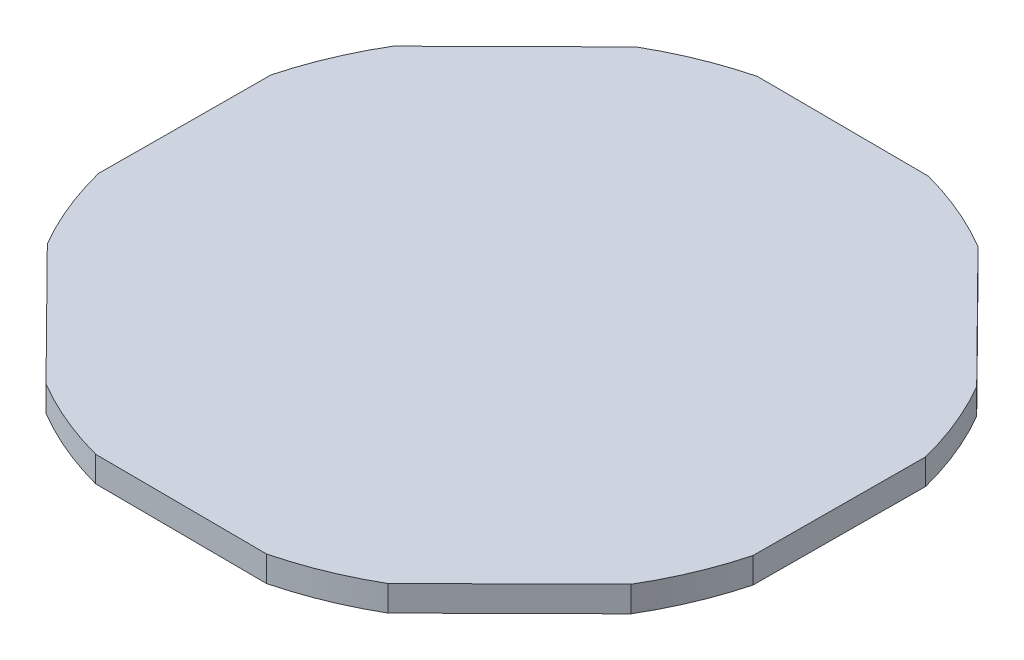
ISO-10303-21;
HEADER;
FILE_DESCRIPTION(('STEP AP214'),'2;1');
FILE_NAME('part.step','',(''),(''),'','','');
FILE_SCHEMA(('AUTOMOTIVE_DESIGN { 1 0 10303 214 1 1 1 1 }'));
ENDSEC;
DATA;
#1=APPLICATION_CONTEXT('core data for automotive mechanical design processes');
#2=APPLICATION_PROTOCOL_DEFINITION('international standard','automotive_design',2000,#1);
#3=PRODUCT_CONTEXT('',#1,'mechanical');
#4=PRODUCT('Part','Part','',(#3));
#5=PRODUCT_RELATED_PRODUCT_CATEGORY('part','',(#4));
#6=PRODUCT_DEFINITION_FORMATION('','',#4);
#7=PRODUCT_DEFINITION_CONTEXT('part definition',#1,'design');
#8=PRODUCT_DEFINITION('design','',#6,#7);
#9=PRODUCT_DEFINITION_SHAPE('','',#8);
#10=(LENGTH_UNIT() NAMED_UNIT(*) SI_UNIT(.MILLI.,.METRE.));
#11=(NAMED_UNIT(*) PLANE_ANGLE_UNIT() SI_UNIT($,.RADIAN.));
#12=(NAMED_UNIT(*) SI_UNIT($,.STERADIAN.) SOLID_ANGLE_UNIT());
#13=UNCERTAINTY_MEASURE_WITH_UNIT(LENGTH_MEASURE(1.E-05),#10,'distance_accuracy_value','');
#14=(GEOMETRIC_REPRESENTATION_CONTEXT(3) GLOBAL_UNCERTAINTY_ASSIGNED_CONTEXT((#13)) GLOBAL_UNIT_ASSIGNED_CONTEXT((#10,
#11,#12)) REPRESENTATION_CONTEXT('',''));
#15=CARTESIAN_POINT('',(0.,0.,0.));
#16=DIRECTION('',(0.,0.,1.));
#17=DIRECTION('',(1.,0.,0.));
#18=AXIS2_PLACEMENT_3D('',#15,#16,#17);
#19=CARTESIAN_POINT('',(0.,-43.64,0.));
#20=DIRECTION('',(0.,1.,0.));
#21=DIRECTION('',(0.,0.,1.));
#22=AXIS2_PLACEMENT_3D('',#19,#20,#21);
#23=PLANE('',#22);
#24=CARTESIAN_POINT('',(0.,-43.64,0.));
#25=DIRECTION('',(0.,1.,0.));
#26=DIRECTION('',(0.,0.,1.));
#27=AXIS2_PLACEMENT_3D('',#24,#25,#26);
#28=CIRCLE('',#27,126.4);
#29=CARTESIAN_POINT('',(-109.404253319129,-43.64,63.3061557487417));
#30=VERTEX_POINT('',#29);
#31=CARTESIAN_POINT('',(-122.471688325826,-43.64,31.2673241359349));
#32=VERTEX_POINT('',#31);
#33=EDGE_CURVE('E237',#30,#32,#28,.F.);
#34=ORIENTED_EDGE('',*,*,#33,.F.);
#35=DIRECTION('',(0.703254513464331,0.,0.710938175435844));
#36=VECTOR('',#35,1.);
#37=CARTESIAN_POINT('',(-51.3220476008247,-43.64,122.022959648436));
#38=LINE('',#37,#36);
#39=CARTESIAN_POINT('',(-64.4912243924798,-43.64,108.709898244635));
#40=VERTEX_POINT('',#39);
#41=EDGE_CURVE('E140',#30,#40,#38,.T.);
#42=ORIENTED_EDGE('',*,*,#41,.T.);
#43=CARTESIAN_POINT('',(0.,-43.64,0.));
#44=DIRECTION('',(0.,1.,0.));
#45=DIRECTION('',(0.,0.,1.));
#46=AXIS2_PLACEMENT_3D('',#43,#44,#45);
#47=CIRCLE('',#46,126.4);
#48=CARTESIAN_POINT('',(-32.5962773918198,-43.64,122.124701433394));
#49=VERTEX_POINT('',#48);
#50=EDGE_CURVE('E240',#49,#40,#47,.F.);
#51=ORIENTED_EDGE('',*,*,#50,.F.);
#52=DIRECTION('',(0.999985240225751,0.,0.00543316948440253));
#53=VECTOR('',#52,1.);
#54=CARTESIAN_POINT('',(49.9930943449399,-43.64,122.573430110784));
#55=LINE('',#54,#53);
#56=CARTESIAN_POINT('',(31.2673241359349,-43.64,122.471688325826));
#57=VERTEX_POINT('',#56);
#58=EDGE_CURVE('E344',#49,#57,#55,.T.);
#59=ORIENTED_EDGE('',*,*,#58,.T.);
#60=CARTESIAN_POINT('',(0.,-43.64,0.));
#61=DIRECTION('',(0.,1.,0.));
#62=DIRECTION('',(0.,0.,1.));
#63=AXIS2_PLACEMENT_3D('',#60,#61,#62);
#64=CIRCLE('',#63,126.4);
#65=CARTESIAN_POINT('',(63.3061557487418,-43.64,109.404253319129));
#66=VERTEX_POINT('',#65);
#67=EDGE_CURVE('E244',#66,#57,#64,.F.);
#68=ORIENTED_EDGE('',*,*,#67,.F.);
#69=DIRECTION('',(0.710938175435844,0.,-0.703254513464331));
#70=VECTOR('',#69,1.);
#71=CARTESIAN_POINT('',(122.022959648436,-43.64,51.3220476008247));
#72=LINE('',#71,#70);
#73=CARTESIAN_POINT('',(108.709898244634,-43.64,64.4912243924799));
#74=VERTEX_POINT('',#73);
#75=EDGE_CURVE('E348',#66,#74,#72,.T.);
#76=ORIENTED_EDGE('',*,*,#75,.T.);
#77=CARTESIAN_POINT('',(0.,-43.64,0.));
#78=DIRECTION('',(0.,1.,0.));
#79=DIRECTION('',(0.,0.,1.));
#80=AXIS2_PLACEMENT_3D('',#77,#78,#79);
#81=CIRCLE('',#80,126.4);
#82=CARTESIAN_POINT('',(122.124701433394,-43.64,32.5962773918199));
#83=VERTEX_POINT('',#82);
#84=EDGE_CURVE('E248',#83,#74,#81,.F.);
#85=ORIENTED_EDGE('',*,*,#84,.F.);
#86=DIRECTION('',(0.00543316948440239,0.,-0.999985240225751));
#87=VECTOR('',#86,1.);
#88=CARTESIAN_POINT('',(122.573430110784,-43.64,-49.9930943449399));
#89=LINE('',#88,#87);
#90=CARTESIAN_POINT('',(122.471688325826,-43.64,-31.2673241359352));
#91=VERTEX_POINT('',#90);
#92=EDGE_CURVE('E272',#83,#91,#89,.T.);
#93=ORIENTED_EDGE('',*,*,#92,.T.);
#94=CARTESIAN_POINT('',(0.,-43.64,0.));
#95=DIRECTION('',(0.,1.,0.));
#96=DIRECTION('',(0.,0.,1.));
#97=AXIS2_PLACEMENT_3D('',#94,#95,#96);
#98=CIRCLE('',#97,126.4);
#99=CARTESIAN_POINT('',(109.404253319129,-43.64,-63.3061557487416));
#100=VERTEX_POINT('',#99);
#101=EDGE_CURVE('E252',#100,#91,#98,.F.);
#102=ORIENTED_EDGE('',*,*,#101,.F.);
#103=DIRECTION('',(-0.703254513464331,0.,-0.710938175435844));
#104=VECTOR('',#103,1.);
#105=CARTESIAN_POINT('',(51.3220476008247,-43.64,-122.022959648436));
#106=LINE('',#105,#104);
#107=CARTESIAN_POINT('',(64.4912243924798,-43.64,-108.709898244635));
#108=VERTEX_POINT('',#107);
#109=EDGE_CURVE('E227',#100,#108,#106,.T.);
#110=ORIENTED_EDGE('',*,*,#109,.T.);
#111=CARTESIAN_POINT('',(0.,-43.64,0.));
#112=DIRECTION('',(0.,1.,0.));
#113=DIRECTION('',(0.,0.,1.));
#114=AXIS2_PLACEMENT_3D('',#111,#112,#113);
#115=CIRCLE('',#114,126.4);
#116=CARTESIAN_POINT('',(32.5962773918198,-43.64,-122.124701433394));
#117=VERTEX_POINT('',#116);
#118=EDGE_CURVE('E187',#117,#108,#115,.F.);
#119=ORIENTED_EDGE('',*,*,#118,.F.);
#120=DIRECTION('',(-0.999985240225751,0.,-0.00543316948440308));
#121=VECTOR('',#120,1.);
#122=CARTESIAN_POINT('',(-49.9930943449398,-43.64,-122.573430110784));
#123=LINE('',#122,#121);
#124=CARTESIAN_POINT('',(-31.2673241359349,-43.64,-122.471688325826));
#125=VERTEX_POINT('',#124);
#126=EDGE_CURVE('E256',#117,#125,#123,.T.);
#127=ORIENTED_EDGE('',*,*,#126,.T.);
#128=CARTESIAN_POINT('',(0.,-43.64,0.));
#129=DIRECTION('',(0.,1.,0.));
#130=DIRECTION('',(0.,0.,1.));
#131=AXIS2_PLACEMENT_3D('',#128,#129,#130);
#132=CIRCLE('',#131,126.4);
#133=CARTESIAN_POINT('',(-63.3061557487416,-43.64,-109.404253319129));
#134=VERTEX_POINT('',#133);
#135=EDGE_CURVE('E228',#134,#125,#132,.F.);
#136=ORIENTED_EDGE('',*,*,#135,.F.);
#137=DIRECTION('',(-0.710938175435844,0.,0.703254513464331));
#138=VECTOR('',#137,1.);
#139=CARTESIAN_POINT('',(-122.022959648436,-43.64,-51.3220476008247));
#140=LINE('',#139,#138);
#141=CARTESIAN_POINT('',(-108.709898244635,-43.64,-64.4912243924799));
#142=VERTEX_POINT('',#141);
#143=EDGE_CURVE('E261',#134,#142,#140,.T.);
#144=ORIENTED_EDGE('',*,*,#143,.T.);
#145=CARTESIAN_POINT('',(0.,-43.64,0.));
#146=DIRECTION('',(0.,1.,0.));
#147=DIRECTION('',(0.,0.,1.));
#148=AXIS2_PLACEMENT_3D('',#145,#146,#147);
#149=CIRCLE('',#148,126.4);
#150=CARTESIAN_POINT('',(-122.124701433394,-43.64,-32.5962773918197));
#151=VERTEX_POINT('',#150);
#152=EDGE_CURVE('E233',#151,#142,#149,.F.);
#153=ORIENTED_EDGE('',*,*,#152,.F.);
#154=DIRECTION('',(-0.00543316948440226,0.,0.999985240225751));
#155=VECTOR('',#154,1.);
#156=CARTESIAN_POINT('',(-122.573430110784,-43.64,49.9930943449399));
#157=LINE('',#156,#155);
#158=EDGE_CURVE('E343',#151,#32,#157,.T.);
#159=ORIENTED_EDGE('',*,*,#158,.T.);
#160=EDGE_LOOP('',(#34,#42,#51,#59,#68,#76,#85,#93,#102,#110,#119,#127,#136,#144,#153,#159));
#161=FACE_BOUND('',#160,.T.);
#162=ADVANCED_FACE('F19',(#161),#23,.T.);
#163=CARTESIAN_POINT('',(0.,-53.14,0.));
#164=DIRECTION('',(0.,1.,0.));
#165=DIRECTION('',(0.,0.,1.));
#166=AXIS2_PLACEMENT_3D('',#163,#164,#165);
#167=CYLINDRICAL_SURFACE('',#166,126.4);
#168=DIRECTION('',(0.,1.,0.));
#169=VECTOR('',#168,1.);
#170=CARTESIAN_POINT('',(109.404253319129,-53.14,-63.3061557487416));
#171=LINE('',#170,#169);
#172=CARTESIAN_POINT('',(109.404253319129,-53.165,-63.3061557487416));
#173=VERTEX_POINT('',#172);
#174=EDGE_CURVE('E11',#173,#100,#171,.T.);
#175=ORIENTED_EDGE('',*,*,#174,.T.);
#176=ORIENTED_EDGE('',*,*,#101,.T.);
#177=DIRECTION('',(0.,-1.,0.));
#178=VECTOR('',#177,1.);
#179=CARTESIAN_POINT('',(122.471688325826,-53.14,-31.2673241359352));
#180=LINE('',#179,#178);
#181=CARTESIAN_POINT('',(122.471688325826,-53.165,-31.2673241359352));
#182=VERTEX_POINT('',#181);
#183=EDGE_CURVE('E182',#91,#182,#180,.T.);
#184=ORIENTED_EDGE('',*,*,#183,.T.);
#185=CARTESIAN_POINT('',(0.,-53.165,0.));
#186=DIRECTION('',(0.,1.,0.));
#187=DIRECTION('',(0.,0.,1.));
#188=AXIS2_PLACEMENT_3D('',#185,#186,#187);
#189=CIRCLE('',#188,126.4);
#190=EDGE_CURVE('E203',#182,#173,#189,.T.);
#191=ORIENTED_EDGE('',*,*,#190,.T.);
#192=EDGE_LOOP('',(#175,#176,#184,#191));
#193=FACE_BOUND('',#192,.T.);
#194=ADVANCED_FACE('F309',(#193),#167,.T.);
#195=CARTESIAN_POINT('',(0.,-53.14,0.));
#196=DIRECTION('',(0.,1.,0.));
#197=DIRECTION('',(0.,0.,1.));
#198=AXIS2_PLACEMENT_3D('',#195,#196,#197);
#199=CYLINDRICAL_SURFACE('',#198,126.4);
#200=DIRECTION('',(0.,1.,0.));
#201=VECTOR('',#200,1.);
#202=CARTESIAN_POINT('',(122.124701433394,-53.14,32.5962773918199));
#203=LINE('',#202,#201);
#204=CARTESIAN_POINT('',(122.124701433393,-53.165,32.5962773918199));
#205=VERTEX_POINT('',#204);
#206=EDGE_CURVE('E178',#205,#83,#203,.T.);
#207=ORIENTED_EDGE('',*,*,#206,.T.);
#208=ORIENTED_EDGE('',*,*,#84,.T.);
#209=DIRECTION('',(0.,-1.,0.));
#210=VECTOR('',#209,1.);
#211=CARTESIAN_POINT('',(108.709898244634,-53.14,64.4912243924799));
#212=LINE('',#211,#210);
#213=CARTESIAN_POINT('',(108.709898244634,-53.165,64.4912243924799));
#214=VERTEX_POINT('',#213);
#215=EDGE_CURVE('E298',#74,#214,#212,.T.);
#216=ORIENTED_EDGE('',*,*,#215,.T.);
#217=CARTESIAN_POINT('',(0.,-53.165,0.));
#218=DIRECTION('',(0.,1.,0.));
#219=DIRECTION('',(0.,0.,1.));
#220=AXIS2_PLACEMENT_3D('',#217,#218,#219);
#221=CIRCLE('',#220,126.4);
#222=EDGE_CURVE('E320',#214,#205,#221,.T.);
#223=ORIENTED_EDGE('',*,*,#222,.T.);
#224=EDGE_LOOP('',(#207,#208,#216,#223));
#225=FACE_BOUND('',#224,.T.);
#226=ADVANCED_FACE('F362',(#225),#199,.T.);
#227=CARTESIAN_POINT('',(0.,-53.14,0.));
#228=DIRECTION('',(0.,1.,0.));
#229=DIRECTION('',(0.,0.,1.));
#230=AXIS2_PLACEMENT_3D('',#227,#228,#229);
#231=CYLINDRICAL_SURFACE('',#230,126.4);
#232=DIRECTION('',(0.,1.,0.));
#233=VECTOR('',#232,1.);
#234=CARTESIAN_POINT('',(63.3061557487418,-53.14,109.404253319129));
#235=LINE('',#234,#233);
#236=CARTESIAN_POINT('',(63.3061557487418,-53.165,109.404253319129));
#237=VERTEX_POINT('',#236);
#238=EDGE_CURVE('E300',#237,#66,#235,.T.);
#239=ORIENTED_EDGE('',*,*,#238,.T.);
#240=ORIENTED_EDGE('',*,*,#67,.T.);
#241=DIRECTION('',(0.,-1.,0.));
#242=VECTOR('',#241,1.);
#243=CARTESIAN_POINT('',(31.2673241359349,-53.14,122.471688325826));
#244=LINE('',#243,#242);
#245=CARTESIAN_POINT('',(31.2673241359349,-53.165,122.471688325826));
#246=VERTEX_POINT('',#245);
#247=EDGE_CURVE('E146',#57,#246,#244,.T.);
#248=ORIENTED_EDGE('',*,*,#247,.T.);
#249=CARTESIAN_POINT('',(0.,-53.165,0.));
#250=DIRECTION('',(0.,1.,0.));
#251=DIRECTION('',(0.,0.,1.));
#252=AXIS2_PLACEMENT_3D('',#249,#250,#251);
#253=CIRCLE('',#252,126.4);
#254=EDGE_CURVE('E328',#246,#237,#253,.T.);
#255=ORIENTED_EDGE('',*,*,#254,.T.);
#256=EDGE_LOOP('',(#239,#240,#248,#255));
#257=FACE_BOUND('',#256,.T.);
#258=ADVANCED_FACE('F384',(#257),#231,.T.);
#259=CARTESIAN_POINT('',(0.,-53.14,0.));
#260=DIRECTION('',(0.,1.,0.));
#261=DIRECTION('',(0.,0.,1.));
#262=AXIS2_PLACEMENT_3D('',#259,#260,#261);
#263=CYLINDRICAL_SURFACE('',#262,126.4);
#264=DIRECTION('',(0.,1.,0.));
#265=VECTOR('',#264,1.);
#266=CARTESIAN_POINT('',(-32.5962773918198,-53.14,122.124701433394));
#267=LINE('',#266,#265);
#268=CARTESIAN_POINT('',(-32.5962773918198,-53.165,122.124701433394));
#269=VERTEX_POINT('',#268);
#270=EDGE_CURVE('E294',#269,#49,#267,.T.);
#271=ORIENTED_EDGE('',*,*,#270,.T.);
#272=ORIENTED_EDGE('',*,*,#50,.T.);
#273=DIRECTION('',(0.,-1.,0.));
#274=VECTOR('',#273,1.);
#275=CARTESIAN_POINT('',(-64.4912243924798,-53.14,108.709898244635));
#276=LINE('',#275,#274);
#277=CARTESIAN_POINT('',(-64.4912243924798,-53.165,108.709898244635));
#278=VERTEX_POINT('',#277);
#279=EDGE_CURVE('E147',#40,#278,#276,.T.);
#280=ORIENTED_EDGE('',*,*,#279,.T.);
#281=CARTESIAN_POINT('',(0.,-53.165,0.));
#282=DIRECTION('',(0.,1.,0.));
#283=DIRECTION('',(0.,0.,1.));
#284=AXIS2_PLACEMENT_3D('',#281,#282,#283);
#285=CIRCLE('',#284,126.4);
#286=EDGE_CURVE('E158',#278,#269,#285,.T.);
#287=ORIENTED_EDGE('',*,*,#286,.T.);
#288=EDGE_LOOP('',(#271,#272,#280,#287));
#289=FACE_BOUND('',#288,.T.);
#290=ADVANCED_FACE('F336',(#289),#263,.T.);
#291=CARTESIAN_POINT('',(0.,-53.14,0.));
#292=DIRECTION('',(0.,1.,0.));
#293=DIRECTION('',(0.,0.,1.));
#294=AXIS2_PLACEMENT_3D('',#291,#292,#293);
#295=CYLINDRICAL_SURFACE('',#294,126.4);
#296=DIRECTION('',(0.,1.,0.));
#297=VECTOR('',#296,1.);
#298=CARTESIAN_POINT('',(-109.404253319129,-53.14,63.3061557487417));
#299=LINE('',#298,#297);
#300=CARTESIAN_POINT('',(-109.404253319129,-53.165,63.3061557487416));
#301=VERTEX_POINT('',#300);
#302=EDGE_CURVE('E135',#301,#30,#299,.T.);
#303=ORIENTED_EDGE('',*,*,#302,.T.);
#304=ORIENTED_EDGE('',*,*,#33,.T.);
#305=DIRECTION('',(0.,-1.,0.));
#306=VECTOR('',#305,1.);
#307=CARTESIAN_POINT('',(-122.471688325826,-53.14,31.2673241359349));
#308=LINE('',#307,#306);
#309=CARTESIAN_POINT('',(-122.471688325826,-53.165,31.2673241359349));
#310=VERTEX_POINT('',#309);
#311=EDGE_CURVE('E162',#32,#310,#308,.T.);
#312=ORIENTED_EDGE('',*,*,#311,.T.);
#313=CARTESIAN_POINT('',(0.,-53.165,0.));
#314=DIRECTION('',(0.,1.,0.));
#315=DIRECTION('',(0.,0.,1.));
#316=AXIS2_PLACEMENT_3D('',#313,#314,#315);
#317=CIRCLE('',#316,126.4);
#318=EDGE_CURVE('E154',#310,#301,#317,.T.);
#319=ORIENTED_EDGE('',*,*,#318,.T.);
#320=EDGE_LOOP('',(#303,#304,#312,#319));
#321=FACE_BOUND('',#320,.T.);
#322=ADVANCED_FACE('F161',(#321),#295,.T.);
#323=CARTESIAN_POINT('',(0.,-53.14,0.));
#324=DIRECTION('',(0.,1.,0.));
#325=DIRECTION('',(0.,0.,1.));
#326=AXIS2_PLACEMENT_3D('',#323,#324,#325);
#327=CYLINDRICAL_SURFACE('',#326,126.4);
#328=DIRECTION('',(0.,1.,0.));
#329=VECTOR('',#328,1.);
#330=CARTESIAN_POINT('',(-122.124701433394,-53.14,-32.5962773918197));
#331=LINE('',#330,#329);
#332=CARTESIAN_POINT('',(-122.124701433394,-53.165,-32.5962773918197));
#333=VERTEX_POINT('',#332);
#334=EDGE_CURVE('E284',#333,#151,#331,.T.);
#335=ORIENTED_EDGE('',*,*,#334,.T.);
#336=ORIENTED_EDGE('',*,*,#152,.T.);
#337=DIRECTION('',(0.,-1.,0.));
#338=VECTOR('',#337,1.);
#339=CARTESIAN_POINT('',(-108.709898244635,-53.14,-64.4912243924799));
#340=LINE('',#339,#338);
#341=CARTESIAN_POINT('',(-108.709898244635,-53.165,-64.4912243924799));
#342=VERTEX_POINT('',#341);
#343=EDGE_CURVE('E280',#142,#342,#340,.T.);
#344=ORIENTED_EDGE('',*,*,#343,.T.);
#345=CARTESIAN_POINT('',(0.,-53.165,0.));
#346=DIRECTION('',(0.,1.,0.));
#347=DIRECTION('',(0.,0.,1.));
#348=AXIS2_PLACEMENT_3D('',#345,#346,#347);
#349=CIRCLE('',#348,126.4);
#350=EDGE_CURVE('E220',#342,#333,#349,.T.);
#351=ORIENTED_EDGE('',*,*,#350,.T.);
#352=EDGE_LOOP('',(#335,#336,#344,#351));
#353=FACE_BOUND('',#352,.T.);
#354=ADVANCED_FACE('F396',(#353),#327,.T.);
#355=CARTESIAN_POINT('',(0.,-53.14,0.));
#356=DIRECTION('',(0.,1.,0.));
#357=DIRECTION('',(0.,0.,1.));
#358=AXIS2_PLACEMENT_3D('',#355,#356,#357);
#359=CYLINDRICAL_SURFACE('',#358,126.4);
#360=DIRECTION('',(0.,1.,0.));
#361=VECTOR('',#360,1.);
#362=CARTESIAN_POINT('',(32.5962773918198,-53.14,-122.124701433394));
#363=LINE('',#362,#361);
#364=CARTESIAN_POINT('',(32.5962773918198,-53.165,-122.124701433394));
#365=VERTEX_POINT('',#364);
#366=EDGE_CURVE('E44',#365,#117,#363,.T.);
#367=ORIENTED_EDGE('',*,*,#366,.T.);
#368=ORIENTED_EDGE('',*,*,#118,.T.);
#369=DIRECTION('',(0.,-1.,0.));
#370=VECTOR('',#369,1.);
#371=CARTESIAN_POINT('',(64.4912243924798,-53.14,-108.709898244635));
#372=LINE('',#371,#370);
#373=CARTESIAN_POINT('',(64.4912243924798,-53.165,-108.709898244635));
#374=VERTEX_POINT('',#373);
#375=EDGE_CURVE('E29',#108,#374,#372,.T.);
#376=ORIENTED_EDGE('',*,*,#375,.T.);
#377=CARTESIAN_POINT('',(0.,-53.165,0.));
#378=DIRECTION('',(0.,1.,0.));
#379=DIRECTION('',(0.,0.,1.));
#380=AXIS2_PLACEMENT_3D('',#377,#378,#379);
#381=CIRCLE('',#380,126.4);
#382=EDGE_CURVE('E186',#374,#365,#381,.T.);
#383=ORIENTED_EDGE('',*,*,#382,.T.);
#384=EDGE_LOOP('',(#367,#368,#376,#383));
#385=FACE_BOUND('',#384,.T.);
#386=ADVANCED_FACE('F185',(#385),#359,.T.);
#387=CARTESIAN_POINT('',(0.,-53.14,0.));
#388=DIRECTION('',(0.,1.,0.));
#389=DIRECTION('',(0.,0.,1.));
#390=AXIS2_PLACEMENT_3D('',#387,#388,#389);
#391=CYLINDRICAL_SURFACE('',#390,126.4);
#392=DIRECTION('',(0.,1.,0.));
#393=VECTOR('',#392,1.);
#394=CARTESIAN_POINT('',(-63.3061557487416,-53.14,-109.404253319129));
#395=LINE('',#394,#393);
#396=CARTESIAN_POINT('',(-63.3061557487416,-53.165,-109.404253319129));
#397=VERTEX_POINT('',#396);
#398=EDGE_CURVE('E418',#397,#134,#395,.T.);
#399=ORIENTED_EDGE('',*,*,#398,.T.);
#400=ORIENTED_EDGE('',*,*,#135,.T.);
#401=DIRECTION('',(0.,-1.,0.));
#402=VECTOR('',#401,1.);
#403=CARTESIAN_POINT('',(-31.2673241359349,-53.14,-122.471688325826));
#404=LINE('',#403,#402);
#405=CARTESIAN_POINT('',(-31.2673241359348,-53.165,-122.471688325826));
#406=VERTEX_POINT('',#405);
#407=EDGE_CURVE('E36',#125,#406,#404,.T.);
#408=ORIENTED_EDGE('',*,*,#407,.T.);
#409=CARTESIAN_POINT('',(0.,-53.165,0.));
#410=DIRECTION('',(0.,1.,0.));
#411=DIRECTION('',(0.,0.,1.));
#412=AXIS2_PLACEMENT_3D('',#409,#410,#411);
#413=CIRCLE('',#412,126.4);
#414=EDGE_CURVE('E212',#406,#397,#413,.T.);
#415=ORIENTED_EDGE('',*,*,#414,.T.);
#416=EDGE_LOOP('',(#399,#400,#408,#415));
#417=FACE_BOUND('',#416,.T.);
#418=ADVANCED_FACE('F409',(#417),#391,.T.);
#419=CARTESIAN_POINT('',(-49.9930943449398,-43.64,-122.573430110784));
#420=DIRECTION('',(-0.00543316948440308,0.,0.999985240225751));
#421=DIRECTION('',(0.,1.,0.));
#422=AXIS2_PLACEMENT_3D('',#419,#420,#421);
#423=PLANE('',#422);
#424=ORIENTED_EDGE('',*,*,#126,.F.);
#425=ORIENTED_EDGE('',*,*,#366,.F.);
#426=DIRECTION('',(-0.999985240225751,0.,-0.00543316948440216));
#427=VECTOR('',#426,1.);
#428=CARTESIAN_POINT('',(32.5962773918198,-53.165,-122.124701433394));
#429=LINE('',#428,#427);
#430=EDGE_CURVE('E198',#365,#406,#429,.T.);
#431=ORIENTED_EDGE('',*,*,#430,.T.);
#432=ORIENTED_EDGE('',*,*,#407,.F.);
#433=EDGE_LOOP('',(#424,#425,#431,#432));
#434=FACE_BOUND('',#433,.T.);
#435=ADVANCED_FACE('F21',(#434),#423,.F.);
#436=CARTESIAN_POINT('',(-122.022959648436,-43.64,-51.3220476008247));
#437=DIRECTION('',(0.703254513464331,0.,0.710938175435844));
#438=DIRECTION('',(0.,-1.,0.));
#439=AXIS2_PLACEMENT_3D('',#436,#437,#438);
#440=PLANE('',#439);
#441=ORIENTED_EDGE('',*,*,#143,.F.);
#442=ORIENTED_EDGE('',*,*,#398,.F.);
#443=DIRECTION('',(-0.710938175435846,0.,0.70325451346433));
#444=VECTOR('',#443,1.);
#445=CARTESIAN_POINT('',(-63.3061557487416,-53.165,-109.404253319129));
#446=LINE('',#445,#444);
#447=EDGE_CURVE('E216',#397,#342,#446,.T.);
#448=ORIENTED_EDGE('',*,*,#447,.T.);
#449=ORIENTED_EDGE('',*,*,#343,.F.);
#450=EDGE_LOOP('',(#441,#442,#448,#449));
#451=FACE_BOUND('',#450,.T.);
#452=ADVANCED_FACE('F407',(#451),#440,.F.);
#453=CARTESIAN_POINT('',(-122.573430110784,-43.64,49.9930943449399));
#454=DIRECTION('',(0.999985240225751,0.,0.00543316948440226));
#455=DIRECTION('',(0.,-1.,0.));
#456=AXIS2_PLACEMENT_3D('',#453,#454,#455);
#457=PLANE('',#456);
#458=ORIENTED_EDGE('',*,*,#158,.F.);
#459=ORIENTED_EDGE('',*,*,#334,.F.);
#460=DIRECTION('',(-0.00543316948440238,0.,0.999985240225751));
#461=VECTOR('',#460,1.);
#462=CARTESIAN_POINT('',(-122.124701433394,-53.165,-32.5962773918197));
#463=LINE('',#462,#461);
#464=EDGE_CURVE('E224',#333,#310,#463,.T.);
#465=ORIENTED_EDGE('',*,*,#464,.T.);
#466=ORIENTED_EDGE('',*,*,#311,.F.);
#467=EDGE_LOOP('',(#458,#459,#465,#466));
#468=FACE_BOUND('',#467,.T.);
#469=ADVANCED_FACE('F401',(#468),#457,.F.);
#470=CARTESIAN_POINT('',(-51.3220476008247,-43.64,122.022959648436));
#471=DIRECTION('',(0.710938175435844,0.,-0.703254513464331));
#472=DIRECTION('',(0.,-1.,0.));
#473=AXIS2_PLACEMENT_3D('',#470,#471,#472);
#474=PLANE('',#473);
#475=ORIENTED_EDGE('',*,*,#41,.F.);
#476=ORIENTED_EDGE('',*,*,#302,.F.);
#477=DIRECTION('',(0.703254513464331,0.,0.710938175435844));
#478=VECTOR('',#477,1.);
#479=CARTESIAN_POINT('',(-109.404253319129,-53.165,63.3061557487416));
#480=LINE('',#479,#478);
#481=EDGE_CURVE('E138',#301,#278,#480,.T.);
#482=ORIENTED_EDGE('',*,*,#481,.T.);
#483=ORIENTED_EDGE('',*,*,#279,.F.);
#484=EDGE_LOOP('',(#475,#476,#482,#483));
#485=FACE_BOUND('',#484,.T.);
#486=ADVANCED_FACE('F137',(#485),#474,.F.);
#487=CARTESIAN_POINT('',(49.9930943449399,-43.64,122.573430110784));
#488=DIRECTION('',(0.00543316948440253,0.,-0.999985240225751));
#489=DIRECTION('',(0.,-1.,0.));
#490=AXIS2_PLACEMENT_3D('',#487,#488,#489);
#491=PLANE('',#490);
#492=ORIENTED_EDGE('',*,*,#58,.F.);
#493=ORIENTED_EDGE('',*,*,#270,.F.);
#494=DIRECTION('',(0.999985240225751,0.,0.00543316948440216));
#495=VECTOR('',#494,1.);
#496=CARTESIAN_POINT('',(-32.5962773918198,-53.165,122.124701433394));
#497=LINE('',#496,#495);
#498=EDGE_CURVE('E331',#269,#246,#497,.T.);
#499=ORIENTED_EDGE('',*,*,#498,.T.);
#500=ORIENTED_EDGE('',*,*,#247,.F.);
#501=EDGE_LOOP('',(#492,#493,#499,#500));
#502=FACE_BOUND('',#501,.T.);
#503=ADVANCED_FACE('F368',(#502),#491,.F.);
#504=CARTESIAN_POINT('',(122.022959648436,-43.64,51.3220476008247));
#505=DIRECTION('',(-0.703254513464331,0.,-0.710938175435844));
#506=DIRECTION('',(-0.710938175435844,0.,0.703254513464331));
#507=AXIS2_PLACEMENT_3D('',#504,#505,#506);
#508=PLANE('',#507);
#509=ORIENTED_EDGE('',*,*,#75,.F.);
#510=ORIENTED_EDGE('',*,*,#238,.F.);
#511=DIRECTION('',(0.710938175435842,0.,-0.703254513464333));
#512=VECTOR('',#511,1.);
#513=CARTESIAN_POINT('',(63.3061557487418,-53.165,109.404253319129));
#514=LINE('',#513,#512);
#515=EDGE_CURVE('E322',#237,#214,#514,.T.);
#516=ORIENTED_EDGE('',*,*,#515,.T.);
#517=ORIENTED_EDGE('',*,*,#215,.F.);
#518=EDGE_LOOP('',(#509,#510,#516,#517));
#519=FACE_BOUND('',#518,.T.);
#520=ADVANCED_FACE('F366',(#519),#508,.F.);
#521=CARTESIAN_POINT('',(122.573430110784,-43.64,-49.9930943449399));
#522=DIRECTION('',(-0.999985240225751,0.,-0.00543316948440239));
#523=DIRECTION('',(-0.00543316948440239,0.,0.999985240225751));
#524=AXIS2_PLACEMENT_3D('',#521,#522,#523);
#525=PLANE('',#524);
#526=ORIENTED_EDGE('',*,*,#92,.F.);
#527=ORIENTED_EDGE('',*,*,#206,.F.);
#528=DIRECTION('',(0.00543316948440343,0.,-0.999985240225751));
#529=VECTOR('',#528,1.);
#530=CARTESIAN_POINT('',(122.124701433393,-53.165,32.5962773918199));
#531=LINE('',#530,#529);
#532=EDGE_CURVE('E206',#205,#182,#531,.T.);
#533=ORIENTED_EDGE('',*,*,#532,.T.);
#534=ORIENTED_EDGE('',*,*,#183,.F.);
#535=EDGE_LOOP('',(#526,#527,#533,#534));
#536=FACE_BOUND('',#535,.T.);
#537=ADVANCED_FACE('F318',(#536),#525,.F.);
#538=CARTESIAN_POINT('',(51.3220476008247,-43.64,-122.022959648436));
#539=DIRECTION('',(-0.710938175435844,0.,0.703254513464331));
#540=DIRECTION('',(0.,1.,0.));
#541=AXIS2_PLACEMENT_3D('',#538,#539,#540);
#542=PLANE('',#541);
#543=ORIENTED_EDGE('',*,*,#109,.F.);
#544=ORIENTED_EDGE('',*,*,#174,.F.);
#545=DIRECTION('',(-0.703254513464331,0.,-0.710938175435845));
#546=VECTOR('',#545,1.);
#547=CARTESIAN_POINT('',(109.404253319129,-53.165,-63.3061557487416));
#548=LINE('',#547,#546);
#549=EDGE_CURVE('E195',#173,#374,#548,.T.);
#550=ORIENTED_EDGE('',*,*,#549,.T.);
#551=ORIENTED_EDGE('',*,*,#375,.F.);
#552=EDGE_LOOP('',(#543,#544,#550,#551));
#553=FACE_BOUND('',#552,.T.);
#554=ADVANCED_FACE('F201',(#553),#542,.F.);
#555=CARTESIAN_POINT('',(0.,-53.165,0.));
#556=DIRECTION('',(0.,1.,0.));
#557=DIRECTION('',(0.,0.,1.));
#558=AXIS2_PLACEMENT_3D('',#555,#556,#557);
#559=PLANE('',#558);
#560=ORIENTED_EDGE('',*,*,#318,.F.);
#561=ORIENTED_EDGE('',*,*,#464,.F.);
#562=ORIENTED_EDGE('',*,*,#350,.F.);
#563=ORIENTED_EDGE('',*,*,#447,.F.);
#564=ORIENTED_EDGE('',*,*,#414,.F.);
#565=ORIENTED_EDGE('',*,*,#430,.F.);
#566=ORIENTED_EDGE('',*,*,#382,.F.);
#567=ORIENTED_EDGE('',*,*,#549,.F.);
#568=ORIENTED_EDGE('',*,*,#190,.F.);
#569=ORIENTED_EDGE('',*,*,#532,.F.);
#570=ORIENTED_EDGE('',*,*,#222,.F.);
#571=ORIENTED_EDGE('',*,*,#515,.F.);
#572=ORIENTED_EDGE('',*,*,#254,.F.);
#573=ORIENTED_EDGE('',*,*,#498,.F.);
#574=ORIENTED_EDGE('',*,*,#286,.F.);
#575=ORIENTED_EDGE('',*,*,#481,.F.);
#576=EDGE_LOOP('',(#560,#561,#562,#563,#564,#565,#566,#567,#568,#569,#570,#571,#572,#573,#574,#575));
#577=FACE_BOUND('',#576,.T.);
#578=ADVANCED_FACE('F152',(#577),#559,.F.);
#579=CLOSED_SHELL('',(#162,#194,#226,#258,#290,#322,#354,#386,#418,#435,#452,#469,#486,#503,
#520,#537,#554,#578));
#580=MANIFOLD_SOLID_BREP('B1',#579);
#581=ADVANCED_BREP_SHAPE_REPRESENTATION('',(#18,#580),#14);
#582=SHAPE_DEFINITION_REPRESENTATION(#9,#581);
ENDSEC;
END-ISO-10303-21;
